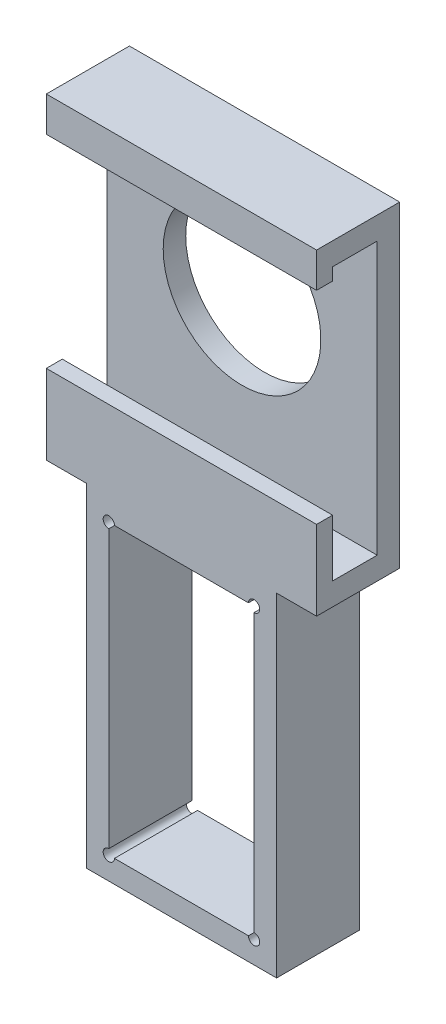
ISO-10303-21;
HEADER;
FILE_DESCRIPTION(('STEP AP214'),'2;1');
FILE_NAME('part.step','',(''),(''),'','','');
FILE_SCHEMA(('AUTOMOTIVE_DESIGN { 1 0 10303 214 1 1 1 1 }'));
ENDSEC;
DATA;
#1=APPLICATION_CONTEXT('core data for automotive mechanical design processes');
#2=APPLICATION_PROTOCOL_DEFINITION('international standard','automotive_design',2000,#1);
#3=PRODUCT_CONTEXT('',#1,'mechanical');
#4=PRODUCT('Part','Part','',(#3));
#5=PRODUCT_RELATED_PRODUCT_CATEGORY('part','',(#4));
#6=PRODUCT_DEFINITION_FORMATION('','',#4);
#7=PRODUCT_DEFINITION_CONTEXT('part definition',#1,'design');
#8=PRODUCT_DEFINITION('design','',#6,#7);
#9=PRODUCT_DEFINITION_SHAPE('','',#8);
#10=(LENGTH_UNIT() NAMED_UNIT(*) SI_UNIT(.MILLI.,.METRE.));
#11=(NAMED_UNIT(*) PLANE_ANGLE_UNIT() SI_UNIT($,.RADIAN.));
#12=(NAMED_UNIT(*) SI_UNIT($,.STERADIAN.) SOLID_ANGLE_UNIT());
#13=UNCERTAINTY_MEASURE_WITH_UNIT(LENGTH_MEASURE(1.E-05),#10,'distance_accuracy_value','');
#14=(GEOMETRIC_REPRESENTATION_CONTEXT(3) GLOBAL_UNCERTAINTY_ASSIGNED_CONTEXT((#13)) GLOBAL_UNIT_ASSIGNED_CONTEXT((#10,
#11,#12)) REPRESENTATION_CONTEXT('',''));
#15=CARTESIAN_POINT('',(0.,0.,0.));
#16=DIRECTION('',(0.,0.,1.));
#17=DIRECTION('',(1.,0.,0.));
#18=AXIS2_PLACEMENT_3D('',#15,#16,#17);
#19=CARTESIAN_POINT('',(-24.,-32.12,-2.));
#20=DIRECTION('',(0.,-1.,0.));
#21=DIRECTION('',(0.,0.,-1.));
#22=AXIS2_PLACEMENT_3D('',#19,#20,#21);
#23=PLANE('',#22);
#24=DIRECTION('',(1.,0.,0.));
#25=VECTOR('',#24,1.);
#26=CARTESIAN_POINT('',(-24.,-32.12,-2.));
#27=LINE('',#26,#25);
#28=CARTESIAN_POINT('',(-24.,-32.12,-2.));
#29=VERTEX_POINT('',#28);
#30=CARTESIAN_POINT('',(-16.9,-32.12,-2.));
#31=VERTEX_POINT('',#30);
#32=EDGE_CURVE('E365',#29,#31,#27,.T.);
#33=ORIENTED_EDGE('',*,*,#32,.T.);
#34=DIRECTION('',(0.,0.,1.));
#35=VECTOR('',#34,1.);
#36=CARTESIAN_POINT('',(-16.9,-32.12,-70.1694946438655));
#37=LINE('',#36,#35);
#38=CARTESIAN_POINT('',(-16.9,-32.12,12.76));
#39=VERTEX_POINT('',#38);
#40=EDGE_CURVE('E257',#31,#39,#37,.T.);
#41=ORIENTED_EDGE('',*,*,#40,.T.);
#42=DIRECTION('',(-1.,0.,0.));
#43=VECTOR('',#42,1.);
#44=CARTESIAN_POINT('',(24.,-32.12,12.76));
#45=LINE('',#44,#43);
#46=CARTESIAN_POINT('',(-24.,-32.12,12.76));
#47=VERTEX_POINT('',#46);
#48=EDGE_CURVE('E277',#39,#47,#45,.T.);
#49=ORIENTED_EDGE('',*,*,#48,.T.);
#50=DIRECTION('',(0.,0.,1.));
#51=VECTOR('',#50,1.);
#52=CARTESIAN_POINT('',(-24.,-32.12,-2.));
#53=LINE('',#52,#51);
#54=EDGE_CURVE('E368',#29,#47,#53,.T.);
#55=ORIENTED_EDGE('',*,*,#54,.F.);
#56=EDGE_LOOP('',(#33,#41,#49,#55));
#57=FACE_BOUND('',#56,.T.);
#58=ADVANCED_FACE('F39',(#57),#23,.T.);
#59=CARTESIAN_POINT('',(0.,0.,2.));
#60=DIRECTION('',(0.,0.,-1.));
#61=DIRECTION('',(-1.,0.,0.));
#62=AXIS2_PLACEMENT_3D('',#59,#60,#61);
#63=PLANE('',#62);
#64=CARTESIAN_POINT('',(0.,0.,2.));
#65=DIRECTION('',(0.,0.,-1.));
#66=DIRECTION('',(-1.,0.,0.));
#67=AXIS2_PLACEMENT_3D('',#64,#65,#66);
#68=CIRCLE('',#67,14.);
#69=CARTESIAN_POINT('',(-14.,0.,2.));
#70=VERTEX_POINT('',#69);
#71=EDGE_CURVE('E274',#70,#70,#68,.T.);
#72=ORIENTED_EDGE('',*,*,#71,.T.);
#73=EDGE_LOOP('',(#72));
#74=FACE_BOUND('',#73,.T.);
#75=DIRECTION('',(0.,1.,0.));
#76=VECTOR('',#75,1.);
#77=CARTESIAN_POINT('',(24.,-32.12,2.));
#78=LINE('',#77,#76);
#79=CARTESIAN_POINT('',(24.,-28.12,2.));
#80=VERTEX_POINT('',#79);
#81=CARTESIAN_POINT('',(24.,20.2,2.));
#82=VERTEX_POINT('',#81);
#83=EDGE_CURVE('E353',#80,#82,#78,.T.);
#84=ORIENTED_EDGE('',*,*,#83,.T.);
#85=DIRECTION('',(-1.,0.,0.));
#86=VECTOR('',#85,1.);
#87=CARTESIAN_POINT('',(24.,20.2,2.));
#88=LINE('',#87,#86);
#89=CARTESIAN_POINT('',(-24.,20.2,2.));
#90=VERTEX_POINT('',#89);
#91=EDGE_CURVE('E291',#82,#90,#88,.T.);
#92=ORIENTED_EDGE('',*,*,#91,.T.);
#93=DIRECTION('',(0.,1.,0.));
#94=VECTOR('',#93,1.);
#95=CARTESIAN_POINT('',(-24.,-32.12,2.));
#96=LINE('',#95,#94);
#97=CARTESIAN_POINT('',(-24.,-28.12,2.));
#98=VERTEX_POINT('',#97);
#99=EDGE_CURVE('E307',#98,#90,#96,.T.);
#100=ORIENTED_EDGE('',*,*,#99,.F.);
#101=DIRECTION('',(-1.,0.,0.));
#102=VECTOR('',#101,1.);
#103=CARTESIAN_POINT('',(24.,-28.12,2.));
#104=LINE('',#103,#102);
#105=EDGE_CURVE('E323',#80,#98,#104,.T.);
#106=ORIENTED_EDGE('',*,*,#105,.F.);
#107=EDGE_LOOP('',(#84,#92,#100,#106));
#108=FACE_BOUND('',#107,.T.);
#109=ADVANCED_FACE('F458',(#74,#108),#63,.F.);
#110=CARTESIAN_POINT('',(-24.,-32.12,-2.));
#111=DIRECTION('',(1.,0.,0.));
#112=DIRECTION('',(0.,0.,-1.));
#113=AXIS2_PLACEMENT_3D('',#110,#111,#112);
#114=PLANE('',#113);
#115=ORIENTED_EDGE('',*,*,#54,.T.);
#116=DIRECTION('',(0.,1.,0.));
#117=VECTOR('',#116,1.);
#118=CARTESIAN_POINT('',(-24.,-32.12,12.76));
#119=LINE('',#118,#117);
#120=CARTESIAN_POINT('',(-24.,-18.,12.76));
#121=VERTEX_POINT('',#120);
#122=EDGE_CURVE('E296',#47,#121,#119,.T.);
#123=ORIENTED_EDGE('',*,*,#122,.T.);
#124=DIRECTION('',(0.,0.,-1.));
#125=VECTOR('',#124,1.);
#126=CARTESIAN_POINT('',(-24.,-18.,12.76));
#127=LINE('',#126,#125);
#128=CARTESIAN_POINT('',(-24.,-18.,9.92));
#129=VERTEX_POINT('',#128);
#130=EDGE_CURVE('E336',#121,#129,#127,.T.);
#131=ORIENTED_EDGE('',*,*,#130,.T.);
#132=DIRECTION('',(0.,-1.,0.));
#133=VECTOR('',#132,1.);
#134=CARTESIAN_POINT('',(-24.,-18.,9.92));
#135=LINE('',#134,#133);
#136=CARTESIAN_POINT('',(-24.,-28.12,9.92));
#137=VERTEX_POINT('',#136);
#138=EDGE_CURVE('E332',#129,#137,#135,.T.);
#139=ORIENTED_EDGE('',*,*,#138,.T.);
#140=DIRECTION('',(0.,0.,-1.));
#141=VECTOR('',#140,1.);
#142=CARTESIAN_POINT('',(-24.,-28.12,9.92));
#143=LINE('',#142,#141);
#144=EDGE_CURVE('E329',#137,#98,#143,.T.);
#145=ORIENTED_EDGE('',*,*,#144,.T.);
#146=ORIENTED_EDGE('',*,*,#99,.T.);
#147=DIRECTION('',(0.,0.,1.));
#148=VECTOR('',#147,1.);
#149=CARTESIAN_POINT('',(-24.,20.2,9.92));
#150=LINE('',#149,#148);
#151=CARTESIAN_POINT('',(-24.,20.2,9.92));
#152=VERTEX_POINT('',#151);
#153=EDGE_CURVE('E292',#90,#152,#150,.T.);
#154=ORIENTED_EDGE('',*,*,#153,.T.);
#155=DIRECTION('',(0.,-1.,0.));
#156=VECTOR('',#155,1.);
#157=CARTESIAN_POINT('',(-24.,18.,9.92));
#158=LINE('',#157,#156);
#159=CARTESIAN_POINT('',(-24.,18.,9.92));
#160=VERTEX_POINT('',#159);
#161=EDGE_CURVE('E295',#152,#160,#158,.T.);
#162=ORIENTED_EDGE('',*,*,#161,.T.);
#163=DIRECTION('',(0.,0.,1.));
#164=VECTOR('',#163,1.);
#165=CARTESIAN_POINT('',(-24.,18.,12.76));
#166=LINE('',#165,#164);
#167=CARTESIAN_POINT('',(-24.,18.,12.76));
#168=VERTEX_POINT('',#167);
#169=EDGE_CURVE('E299',#160,#168,#166,.T.);
#170=ORIENTED_EDGE('',*,*,#169,.T.);
#171=DIRECTION('',(0.,1.,0.));
#172=VECTOR('',#171,1.);
#173=CARTESIAN_POINT('',(-24.,24.2,12.76));
#174=LINE('',#173,#172);
#175=CARTESIAN_POINT('',(-24.,24.2,12.76));
#176=VERTEX_POINT('',#175);
#177=EDGE_CURVE('E282',#168,#176,#174,.T.);
#178=ORIENTED_EDGE('',*,*,#177,.T.);
#179=DIRECTION('',(0.,0.,1.));
#180=VECTOR('',#179,1.);
#181=CARTESIAN_POINT('',(-24.,24.2,-2.));
#182=LINE('',#181,#180);
#183=CARTESIAN_POINT('',(-24.,24.2,-2.));
#184=VERTEX_POINT('',#183);
#185=EDGE_CURVE('E375',#184,#176,#182,.T.);
#186=ORIENTED_EDGE('',*,*,#185,.F.);
#187=DIRECTION('',(0.,1.,0.));
#188=VECTOR('',#187,1.);
#189=CARTESIAN_POINT('',(-24.,-32.12,-2.));
#190=LINE('',#189,#188);
#191=EDGE_CURVE('E356',#29,#184,#190,.T.);
#192=ORIENTED_EDGE('',*,*,#191,.F.);
#193=EDGE_LOOP('',(#115,#123,#131,#139,#145,#146,#154,#162,#170,#178,#186,#192));
#194=FACE_BOUND('',#193,.T.);
#195=ADVANCED_FACE('F41',(#194),#114,.F.);
#196=CARTESIAN_POINT('',(-24.,24.2,-2.));
#197=DIRECTION('',(0.,-1.,0.));
#198=DIRECTION('',(1.,0.,0.));
#199=AXIS2_PLACEMENT_3D('',#196,#197,#198);
#200=PLANE('',#199);
#201=ORIENTED_EDGE('',*,*,#185,.T.);
#202=DIRECTION('',(-1.,0.,0.));
#203=VECTOR('',#202,1.);
#204=CARTESIAN_POINT('',(24.,24.2,12.76));
#205=LINE('',#204,#203);
#206=CARTESIAN_POINT('',(24.,24.2,12.76));
#207=VERTEX_POINT('',#206);
#208=EDGE_CURVE('E304',#207,#176,#205,.T.);
#209=ORIENTED_EDGE('',*,*,#208,.F.);
#210=DIRECTION('',(0.,0.,1.));
#211=VECTOR('',#210,1.);
#212=CARTESIAN_POINT('',(24.,24.2,-2.));
#213=LINE('',#212,#211);
#214=CARTESIAN_POINT('',(24.,24.2,-2.));
#215=VERTEX_POINT('',#214);
#216=EDGE_CURVE('E373',#215,#207,#213,.T.);
#217=ORIENTED_EDGE('',*,*,#216,.F.);
#218=DIRECTION('',(1.,0.,0.));
#219=VECTOR('',#218,1.);
#220=CARTESIAN_POINT('',(-24.,24.2,-2.));
#221=LINE('',#220,#219);
#222=EDGE_CURVE('E359',#184,#215,#221,.T.);
#223=ORIENTED_EDGE('',*,*,#222,.F.);
#224=EDGE_LOOP('',(#201,#209,#217,#223));
#225=FACE_BOUND('',#224,.T.);
#226=ADVANCED_FACE('F441',(#225),#200,.F.);
#227=CARTESIAN_POINT('',(24.,-32.12,-2.));
#228=DIRECTION('',(1.,0.,0.));
#229=DIRECTION('',(0.,0.,-1.));
#230=AXIS2_PLACEMENT_3D('',#227,#228,#229);
#231=PLANE('',#230);
#232=ORIENTED_EDGE('',*,*,#216,.T.);
#233=DIRECTION('',(0.,1.,0.));
#234=VECTOR('',#233,1.);
#235=CARTESIAN_POINT('',(24.,24.2,12.76));
#236=LINE('',#235,#234);
#237=CARTESIAN_POINT('',(24.,18.,12.76));
#238=VERTEX_POINT('',#237);
#239=EDGE_CURVE('E288',#238,#207,#236,.T.);
#240=ORIENTED_EDGE('',*,*,#239,.F.);
#241=DIRECTION('',(0.,0.,1.));
#242=VECTOR('',#241,1.);
#243=CARTESIAN_POINT('',(24.,18.,12.76));
#244=LINE('',#243,#242);
#245=CARTESIAN_POINT('',(24.,18.,9.92));
#246=VERTEX_POINT('',#245);
#247=EDGE_CURVE('E285',#246,#238,#244,.T.);
#248=ORIENTED_EDGE('',*,*,#247,.F.);
#249=DIRECTION('',(0.,-1.,0.));
#250=VECTOR('',#249,1.);
#251=CARTESIAN_POINT('',(24.,18.,9.92));
#252=LINE('',#251,#250);
#253=CARTESIAN_POINT('',(24.,20.2,9.92));
#254=VERTEX_POINT('',#253);
#255=EDGE_CURVE('E281',#254,#246,#252,.T.);
#256=ORIENTED_EDGE('',*,*,#255,.F.);
#257=DIRECTION('',(0.,0.,1.));
#258=VECTOR('',#257,1.);
#259=CARTESIAN_POINT('',(24.,20.2,9.92));
#260=LINE('',#259,#258);
#261=EDGE_CURVE('E278',#82,#254,#260,.T.);
#262=ORIENTED_EDGE('',*,*,#261,.F.);
#263=ORIENTED_EDGE('',*,*,#83,.F.);
#264=DIRECTION('',(0.,0.,-1.));
#265=VECTOR('',#264,1.);
#266=CARTESIAN_POINT('',(24.,-28.12,9.92));
#267=LINE('',#266,#265);
#268=CARTESIAN_POINT('',(24.,-28.12,9.92));
#269=VERTEX_POINT('',#268);
#270=EDGE_CURVE('E318',#269,#80,#267,.T.);
#271=ORIENTED_EDGE('',*,*,#270,.F.);
#272=DIRECTION('',(0.,-1.,0.));
#273=VECTOR('',#272,1.);
#274=CARTESIAN_POINT('',(24.,-18.,9.92));
#275=LINE('',#274,#273);
#276=CARTESIAN_POINT('',(24.,-18.,9.92));
#277=VERTEX_POINT('',#276);
#278=EDGE_CURVE('E343',#277,#269,#275,.T.);
#279=ORIENTED_EDGE('',*,*,#278,.F.);
#280=DIRECTION('',(0.,0.,-1.));
#281=VECTOR('',#280,1.);
#282=CARTESIAN_POINT('',(24.,-18.,12.76));
#283=LINE('',#282,#281);
#284=CARTESIAN_POINT('',(24.,-18.,12.76));
#285=VERTEX_POINT('',#284);
#286=EDGE_CURVE('E346',#285,#277,#283,.T.);
#287=ORIENTED_EDGE('',*,*,#286,.F.);
#288=DIRECTION('',(0.,1.,0.));
#289=VECTOR('',#288,1.);
#290=CARTESIAN_POINT('',(24.,-32.12,12.76));
#291=LINE('',#290,#289);
#292=CARTESIAN_POINT('',(24.,-32.12,12.76));
#293=VERTEX_POINT('',#292);
#294=EDGE_CURVE('E333',#293,#285,#291,.T.);
#295=ORIENTED_EDGE('',*,*,#294,.F.);
#296=DIRECTION('',(0.,0.,1.));
#297=VECTOR('',#296,1.);
#298=CARTESIAN_POINT('',(24.,-32.12,-2.));
#299=LINE('',#298,#297);
#300=CARTESIAN_POINT('',(24.,-32.12,-2.));
#301=VERTEX_POINT('',#300);
#302=EDGE_CURVE('E371',#301,#293,#299,.T.);
#303=ORIENTED_EDGE('',*,*,#302,.F.);
#304=DIRECTION('',(0.,1.,0.));
#305=VECTOR('',#304,1.);
#306=CARTESIAN_POINT('',(24.,-32.12,-2.));
#307=LINE('',#306,#305);
#308=EDGE_CURVE('E361',#301,#215,#307,.T.);
#309=ORIENTED_EDGE('',*,*,#308,.T.);
#310=EDGE_LOOP('',(#232,#240,#248,#256,#262,#263,#271,#279,#287,#295,#303,#309));
#311=FACE_BOUND('',#310,.T.);
#312=ADVANCED_FACE('F436',(#311),#231,.T.);
#313=DIRECTION('',(0.,0.,1.));
#314=VECTOR('',#313,1.);
#315=CARTESIAN_POINT('',(16.9,-32.12,-70.1694946438655));
#316=LINE('',#315,#314);
#317=CARTESIAN_POINT('',(16.9,-32.12,-2.));
#318=VERTEX_POINT('',#317);
#319=CARTESIAN_POINT('',(16.9,-32.12,12.76));
#320=VERTEX_POINT('',#319);
#321=EDGE_CURVE('E238',#318,#320,#316,.T.);
#322=ORIENTED_EDGE('',*,*,#321,.F.);
#323=EDGE_CURVE('E364',#318,#301,#27,.T.);
#324=ORIENTED_EDGE('',*,*,#323,.T.);
#325=ORIENTED_EDGE('',*,*,#302,.T.);
#326=EDGE_CURVE('E326',#293,#320,#45,.T.);
#327=ORIENTED_EDGE('',*,*,#326,.T.);
#328=EDGE_LOOP('',(#322,#324,#325,#327));
#329=FACE_BOUND('',#328,.T.);
#330=ADVANCED_FACE('F431',(#329),#23,.T.);
#331=CARTESIAN_POINT('',(0.,0.,-2.));
#332=DIRECTION('',(0.,0.,-1.));
#333=DIRECTION('',(-1.,0.,0.));
#334=AXIS2_PLACEMENT_3D('',#331,#332,#333);
#335=PLANE('',#334);
#336=CARTESIAN_POINT('',(-12.9,-87.32,-2.));
#337=DIRECTION('',(0.,0.,1.));
#338=DIRECTION('',(1.,0.,0.));
#339=AXIS2_PLACEMENT_3D('',#336,#337,#338);
#340=CIRCLE('',#339,1.);
#341=CARTESIAN_POINT('',(-12.9,-86.32,-2.));
#342=VERTEX_POINT('',#341);
#343=CARTESIAN_POINT('',(-11.9,-87.32,-2.));
#344=VERTEX_POINT('',#343);
#345=EDGE_CURVE('E391',#342,#344,#340,.T.);
#346=ORIENTED_EDGE('',*,*,#345,.T.);
#347=DIRECTION('',(1.,0.,0.));
#348=VECTOR('',#347,1.);
#349=CARTESIAN_POINT('',(-12.9,-87.32,-2.));
#350=LINE('',#349,#348);
#351=CARTESIAN_POINT('',(11.9,-87.32,-2.));
#352=VERTEX_POINT('',#351);
#353=EDGE_CURVE('E242',#344,#352,#350,.T.);
#354=ORIENTED_EDGE('',*,*,#353,.T.);
#355=CARTESIAN_POINT('',(12.9,-87.32,-2.));
#356=DIRECTION('',(0.,0.,1.));
#357=DIRECTION('',(1.,0.,0.));
#358=AXIS2_PLACEMENT_3D('',#355,#356,#357);
#359=CIRCLE('',#358,1.);
#360=CARTESIAN_POINT('',(12.9,-86.32,-2.));
#361=VERTEX_POINT('',#360);
#362=EDGE_CURVE('E744',#352,#361,#359,.T.);
#363=ORIENTED_EDGE('',*,*,#362,.T.);
#364=DIRECTION('',(0.,1.,0.));
#365=VECTOR('',#364,1.);
#366=CARTESIAN_POINT('',(12.9,-36.12,-2.));
#367=LINE('',#366,#365);
#368=CARTESIAN_POINT('',(12.9,-37.12,-2.));
#369=VERTEX_POINT('',#368);
#370=EDGE_CURVE('E246',#361,#369,#367,.T.);
#371=ORIENTED_EDGE('',*,*,#370,.T.);
#372=CARTESIAN_POINT('',(12.9,-36.12,-2.));
#373=DIRECTION('',(0.,0.,1.));
#374=DIRECTION('',(1.,0.,0.));
#375=AXIS2_PLACEMENT_3D('',#372,#373,#374);
#376=CIRCLE('',#375,1.);
#377=CARTESIAN_POINT('',(11.9,-36.12,-2.));
#378=VERTEX_POINT('',#377);
#379=EDGE_CURVE('E749',#369,#378,#376,.T.);
#380=ORIENTED_EDGE('',*,*,#379,.T.);
#381=DIRECTION('',(-1.,0.,0.));
#382=VECTOR('',#381,1.);
#383=CARTESIAN_POINT('',(-12.9,-36.12,-2.));
#384=LINE('',#383,#382);
#385=CARTESIAN_POINT('',(-11.9,-36.12,-2.));
#386=VERTEX_POINT('',#385);
#387=EDGE_CURVE('E243',#378,#386,#384,.T.);
#388=ORIENTED_EDGE('',*,*,#387,.T.);
#389=CARTESIAN_POINT('',(-12.9,-36.12,-2.));
#390=DIRECTION('',(0.,0.,1.));
#391=DIRECTION('',(1.,0.,0.));
#392=AXIS2_PLACEMENT_3D('',#389,#390,#391);
#393=CIRCLE('',#392,1.);
#394=CARTESIAN_POINT('',(-12.9,-37.12,-2.));
#395=VERTEX_POINT('',#394);
#396=EDGE_CURVE('E204',#386,#395,#393,.T.);
#397=ORIENTED_EDGE('',*,*,#396,.T.);
#398=DIRECTION('',(0.,-1.,0.));
#399=VECTOR('',#398,1.);
#400=CARTESIAN_POINT('',(-12.9,-36.12,-2.));
#401=LINE('',#400,#399);
#402=EDGE_CURVE('E239',#395,#342,#401,.T.);
#403=ORIENTED_EDGE('',*,*,#402,.T.);
#404=EDGE_LOOP('',(#346,#354,#363,#371,#380,#388,#397,#403));
#405=FACE_BOUND('',#404,.T.);
#406=CARTESIAN_POINT('',(0.,0.,-2.));
#407=DIRECTION('',(0.,0.,-1.));
#408=DIRECTION('',(-1.,0.,0.));
#409=AXIS2_PLACEMENT_3D('',#406,#407,#408);
#410=CIRCLE('',#409,14.);
#411=CARTESIAN_POINT('',(-14.,0.,-2.));
#412=VERTEX_POINT('',#411);
#413=EDGE_CURVE('E271',#412,#412,#410,.T.);
#414=ORIENTED_EDGE('',*,*,#413,.F.);
#415=EDGE_LOOP('',(#414));
#416=FACE_BOUND('',#415,.T.);
#417=ORIENTED_EDGE('',*,*,#191,.T.);
#418=ORIENTED_EDGE('',*,*,#222,.T.);
#419=ORIENTED_EDGE('',*,*,#308,.F.);
#420=ORIENTED_EDGE('',*,*,#323,.F.);
#421=DIRECTION('',(0.,1.,0.));
#422=VECTOR('',#421,1.);
#423=CARTESIAN_POINT('',(16.9,-32.12,-2.));
#424=LINE('',#423,#422);
#425=CARTESIAN_POINT('',(16.9,-91.32,-2.));
#426=VERTEX_POINT('',#425);
#427=EDGE_CURVE('E255',#426,#318,#424,.T.);
#428=ORIENTED_EDGE('',*,*,#427,.F.);
#429=DIRECTION('',(1.,0.,0.));
#430=VECTOR('',#429,1.);
#431=CARTESIAN_POINT('',(-16.9,-91.32,-2.));
#432=LINE('',#431,#430);
#433=CARTESIAN_POINT('',(-16.9,-91.32,-2.));
#434=VERTEX_POINT('',#433);
#435=EDGE_CURVE('E235',#434,#426,#432,.T.);
#436=ORIENTED_EDGE('',*,*,#435,.F.);
#437=DIRECTION('',(0.,-1.,0.));
#438=VECTOR('',#437,1.);
#439=CARTESIAN_POINT('',(-16.9,-32.12,-2.));
#440=LINE('',#439,#438);
#441=EDGE_CURVE('E250',#31,#434,#440,.T.);
#442=ORIENTED_EDGE('',*,*,#441,.F.);
#443=ORIENTED_EDGE('',*,*,#32,.F.);
#444=EDGE_LOOP('',(#417,#418,#419,#420,#428,#436,#442,#443));
#445=FACE_BOUND('',#444,.T.);
#446=ADVANCED_FACE('F389',(#405,#416,#445),#335,.T.);
#447=CARTESIAN_POINT('',(24.,-32.12,12.76));
#448=DIRECTION('',(0.,0.,1.));
#449=DIRECTION('',(1.,0.,0.));
#450=AXIS2_PLACEMENT_3D('',#447,#448,#449);
#451=PLANE('',#450);
#452=CARTESIAN_POINT('',(-12.9,-87.32,12.76));
#453=DIRECTION('',(0.,0.,1.));
#454=DIRECTION('',(1.,0.,0.));
#455=AXIS2_PLACEMENT_3D('',#452,#453,#454);
#456=CIRCLE('',#455,1.);
#457=CARTESIAN_POINT('',(-12.9,-86.32,12.76));
#458=VERTEX_POINT('',#457);
#459=CARTESIAN_POINT('',(-11.9,-87.32,12.76));
#460=VERTEX_POINT('',#459);
#461=EDGE_CURVE('E743',#458,#460,#456,.T.);
#462=ORIENTED_EDGE('',*,*,#461,.F.);
#463=DIRECTION('',(0.,-1.,0.));
#464=VECTOR('',#463,1.);
#465=CARTESIAN_POINT('',(-12.9,-36.12,12.76));
#466=LINE('',#465,#464);
#467=CARTESIAN_POINT('',(-12.9,-37.12,12.76));
#468=VERTEX_POINT('',#467);
#469=EDGE_CURVE('E219',#468,#458,#466,.T.);
#470=ORIENTED_EDGE('',*,*,#469,.F.);
#471=CARTESIAN_POINT('',(-12.9,-36.12,12.76));
#472=DIRECTION('',(0.,0.,1.));
#473=DIRECTION('',(1.,0.,0.));
#474=AXIS2_PLACEMENT_3D('',#471,#472,#473);
#475=CIRCLE('',#474,1.);
#476=CARTESIAN_POINT('',(-11.9,-36.12,12.76));
#477=VERTEX_POINT('',#476);
#478=EDGE_CURVE('E201',#477,#468,#475,.T.);
#479=ORIENTED_EDGE('',*,*,#478,.F.);
#480=DIRECTION('',(-1.,0.,0.));
#481=VECTOR('',#480,1.);
#482=CARTESIAN_POINT('',(-12.9,-36.12,12.76));
#483=LINE('',#482,#481);
#484=CARTESIAN_POINT('',(11.9,-36.12,12.76));
#485=VERTEX_POINT('',#484);
#486=EDGE_CURVE('E217',#485,#477,#483,.T.);
#487=ORIENTED_EDGE('',*,*,#486,.F.);
#488=CARTESIAN_POINT('',(12.9,-36.12,12.76));
#489=DIRECTION('',(0.,0.,1.));
#490=DIRECTION('',(1.,0.,0.));
#491=AXIS2_PLACEMENT_3D('',#488,#489,#490);
#492=CIRCLE('',#491,1.);
#493=CARTESIAN_POINT('',(12.9,-37.12,12.76));
#494=VERTEX_POINT('',#493);
#495=EDGE_CURVE('E61',#494,#485,#492,.T.);
#496=ORIENTED_EDGE('',*,*,#495,.F.);
#497=DIRECTION('',(0.,1.,0.));
#498=VECTOR('',#497,1.);
#499=CARTESIAN_POINT('',(12.9,-36.12,12.76));
#500=LINE('',#499,#498);
#501=CARTESIAN_POINT('',(12.9,-86.32,12.76));
#502=VERTEX_POINT('',#501);
#503=EDGE_CURVE('E222',#502,#494,#500,.T.);
#504=ORIENTED_EDGE('',*,*,#503,.F.);
#505=CARTESIAN_POINT('',(12.9,-87.32,12.76));
#506=DIRECTION('',(0.,0.,1.));
#507=DIRECTION('',(1.,0.,0.));
#508=AXIS2_PLACEMENT_3D('',#505,#506,#507);
#509=CIRCLE('',#508,1.);
#510=CARTESIAN_POINT('',(11.9,-87.32,12.76));
#511=VERTEX_POINT('',#510);
#512=EDGE_CURVE('E54',#511,#502,#509,.T.);
#513=ORIENTED_EDGE('',*,*,#512,.F.);
#514=DIRECTION('',(1.,0.,0.));
#515=VECTOR('',#514,1.);
#516=CARTESIAN_POINT('',(-12.9,-87.32,12.76));
#517=LINE('',#516,#515);
#518=EDGE_CURVE('E225',#460,#511,#517,.T.);
#519=ORIENTED_EDGE('',*,*,#518,.F.);
#520=EDGE_LOOP('',(#462,#470,#479,#487,#496,#504,#513,#519));
#521=FACE_BOUND('',#520,.T.);
#522=ORIENTED_EDGE('',*,*,#122,.F.);
#523=ORIENTED_EDGE('',*,*,#48,.F.);
#524=DIRECTION('',(0.,-1.,0.));
#525=VECTOR('',#524,1.);
#526=CARTESIAN_POINT('',(-16.9,-32.12,12.76));
#527=LINE('',#526,#525);
#528=CARTESIAN_POINT('',(-16.9,-91.32,12.76));
#529=VERTEX_POINT('',#528);
#530=EDGE_CURVE('E230',#39,#529,#527,.T.);
#531=ORIENTED_EDGE('',*,*,#530,.T.);
#532=DIRECTION('',(1.,0.,0.));
#533=VECTOR('',#532,1.);
#534=CARTESIAN_POINT('',(-16.9,-91.32,12.76));
#535=LINE('',#534,#533);
#536=CARTESIAN_POINT('',(16.9,-91.32,12.76));
#537=VERTEX_POINT('',#536);
#538=EDGE_CURVE('E406',#529,#537,#535,.T.);
#539=ORIENTED_EDGE('',*,*,#538,.T.);
#540=DIRECTION('',(0.,1.,0.));
#541=VECTOR('',#540,1.);
#542=CARTESIAN_POINT('',(16.9,-32.12,12.76));
#543=LINE('',#542,#541);
#544=EDGE_CURVE('E245',#537,#320,#543,.T.);
#545=ORIENTED_EDGE('',*,*,#544,.T.);
#546=ORIENTED_EDGE('',*,*,#326,.F.);
#547=ORIENTED_EDGE('',*,*,#294,.T.);
#548=DIRECTION('',(-1.,0.,0.));
#549=VECTOR('',#548,1.);
#550=CARTESIAN_POINT('',(24.,-18.,12.76));
#551=LINE('',#550,#549);
#552=EDGE_CURVE('E316',#285,#121,#551,.T.);
#553=ORIENTED_EDGE('',*,*,#552,.T.);
#554=EDGE_LOOP('',(#522,#523,#531,#539,#545,#546,#547,#553));
#555=FACE_BOUND('',#554,.T.);
#556=ADVANCED_FACE('F215',(#521,#555),#451,.T.);
#557=CARTESIAN_POINT('',(24.,-28.12,9.92));
#558=DIRECTION('',(0.,1.,0.));
#559=DIRECTION('',(0.,0.,1.));
#560=AXIS2_PLACEMENT_3D('',#557,#558,#559);
#561=PLANE('',#560);
#562=CARTESIAN_POINT('',(0.,-28.12,5.37999999999999));
#563=DIRECTION('',(0.,1.,0.));
#564=DIRECTION('',(0.,0.,1.));
#565=AXIS2_PLACEMENT_3D('',#562,#563,#564);
#566=CIRCLE('',#565,2.24789999999999);
#567=CARTESIAN_POINT('',(0.,-28.12,7.62789999999999));
#568=VERTEX_POINT('',#567);
#569=EDGE_CURVE('E270',#568,#568,#566,.T.);
#570=ORIENTED_EDGE('',*,*,#569,.F.);
#571=EDGE_LOOP('',(#570));
#572=FACE_BOUND('',#571,.T.);
#573=ORIENTED_EDGE('',*,*,#144,.F.);
#574=DIRECTION('',(-1.,0.,0.));
#575=VECTOR('',#574,1.);
#576=CARTESIAN_POINT('',(24.,-28.12,9.92));
#577=LINE('',#576,#575);
#578=EDGE_CURVE('E321',#269,#137,#577,.T.);
#579=ORIENTED_EDGE('',*,*,#578,.F.);
#580=ORIENTED_EDGE('',*,*,#270,.T.);
#581=ORIENTED_EDGE('',*,*,#105,.T.);
#582=EDGE_LOOP('',(#573,#579,#580,#581));
#583=FACE_BOUND('',#582,.T.);
#584=ADVANCED_FACE('F463',(#572,#583),#561,.T.);
#585=CARTESIAN_POINT('',(24.,-18.,9.92));
#586=DIRECTION('',(0.,0.,-1.));
#587=DIRECTION('',(0.,1.,0.));
#588=AXIS2_PLACEMENT_3D('',#585,#586,#587);
#589=PLANE('',#588);
#590=ORIENTED_EDGE('',*,*,#138,.F.);
#591=DIRECTION('',(-1.,0.,0.));
#592=VECTOR('',#591,1.);
#593=CARTESIAN_POINT('',(24.,-18.,9.92));
#594=LINE('',#593,#592);
#595=EDGE_CURVE('E319',#277,#129,#594,.T.);
#596=ORIENTED_EDGE('',*,*,#595,.F.);
#597=ORIENTED_EDGE('',*,*,#278,.T.);
#598=ORIENTED_EDGE('',*,*,#578,.T.);
#599=EDGE_LOOP('',(#590,#596,#597,#598));
#600=FACE_BOUND('',#599,.T.);
#601=ADVANCED_FACE('F467',(#600),#589,.T.);
#602=CARTESIAN_POINT('',(24.,-18.,12.76));
#603=DIRECTION('',(0.,1.,0.));
#604=DIRECTION('',(0.,0.,1.));
#605=AXIS2_PLACEMENT_3D('',#602,#603,#604);
#606=PLANE('',#605);
#607=ORIENTED_EDGE('',*,*,#130,.F.);
#608=ORIENTED_EDGE('',*,*,#552,.F.);
#609=ORIENTED_EDGE('',*,*,#286,.T.);
#610=ORIENTED_EDGE('',*,*,#595,.T.);
#611=EDGE_LOOP('',(#607,#608,#609,#610));
#612=FACE_BOUND('',#611,.T.);
#613=ADVANCED_FACE('F470',(#612),#606,.T.);
#614=CARTESIAN_POINT('',(24.,24.2,12.76));
#615=DIRECTION('',(0.,0.,1.));
#616=DIRECTION('',(0.,-1.,0.));
#617=AXIS2_PLACEMENT_3D('',#614,#615,#616);
#618=PLANE('',#617);
#619=ORIENTED_EDGE('',*,*,#177,.F.);
#620=DIRECTION('',(-1.,0.,0.));
#621=VECTOR('',#620,1.);
#622=CARTESIAN_POINT('',(24.,18.,12.76));
#623=LINE('',#622,#621);
#624=EDGE_CURVE('E308',#238,#168,#623,.T.);
#625=ORIENTED_EDGE('',*,*,#624,.F.);
#626=ORIENTED_EDGE('',*,*,#239,.T.);
#627=ORIENTED_EDGE('',*,*,#208,.T.);
#628=EDGE_LOOP('',(#619,#625,#626,#627));
#629=FACE_BOUND('',#628,.T.);
#630=ADVANCED_FACE('F471',(#629),#618,.T.);
#631=CARTESIAN_POINT('',(24.,18.,12.76));
#632=DIRECTION('',(0.,-1.,0.));
#633=DIRECTION('',(0.,0.,-1.));
#634=AXIS2_PLACEMENT_3D('',#631,#632,#633);
#635=PLANE('',#634);
#636=ORIENTED_EDGE('',*,*,#169,.F.);
#637=DIRECTION('',(-1.,0.,0.));
#638=VECTOR('',#637,1.);
#639=CARTESIAN_POINT('',(24.,18.,9.92));
#640=LINE('',#639,#638);
#641=EDGE_CURVE('E310',#246,#160,#640,.T.);
#642=ORIENTED_EDGE('',*,*,#641,.F.);
#643=ORIENTED_EDGE('',*,*,#247,.T.);
#644=ORIENTED_EDGE('',*,*,#624,.T.);
#645=EDGE_LOOP('',(#636,#642,#643,#644));
#646=FACE_BOUND('',#645,.T.);
#647=ADVANCED_FACE('F448',(#646),#635,.T.);
#648=CARTESIAN_POINT('',(24.,18.,9.92));
#649=DIRECTION('',(0.,0.,-1.));
#650=DIRECTION('',(-1.,0.,0.));
#651=AXIS2_PLACEMENT_3D('',#648,#649,#650);
#652=PLANE('',#651);
#653=ORIENTED_EDGE('',*,*,#161,.F.);
#654=DIRECTION('',(-1.,0.,0.));
#655=VECTOR('',#654,1.);
#656=CARTESIAN_POINT('',(24.,20.2,9.92));
#657=LINE('',#656,#655);
#658=EDGE_CURVE('E312',#254,#152,#657,.T.);
#659=ORIENTED_EDGE('',*,*,#658,.F.);
#660=ORIENTED_EDGE('',*,*,#255,.T.);
#661=ORIENTED_EDGE('',*,*,#641,.T.);
#662=EDGE_LOOP('',(#653,#659,#660,#661));
#663=FACE_BOUND('',#662,.T.);
#664=ADVANCED_FACE('F452',(#663),#652,.T.);
#665=CARTESIAN_POINT('',(24.,20.2,9.92));
#666=DIRECTION('',(0.,-1.,0.));
#667=DIRECTION('',(0.,0.,-1.));
#668=AXIS2_PLACEMENT_3D('',#665,#666,#667);
#669=PLANE('',#668);
#670=ORIENTED_EDGE('',*,*,#153,.F.);
#671=ORIENTED_EDGE('',*,*,#91,.F.);
#672=ORIENTED_EDGE('',*,*,#261,.T.);
#673=ORIENTED_EDGE('',*,*,#658,.T.);
#674=EDGE_LOOP('',(#670,#671,#672,#673));
#675=FACE_BOUND('',#674,.T.);
#676=ADVANCED_FACE('F456',(#675),#669,.T.);
#677=CARTESIAN_POINT('',(0.,0.,12.76));
#678=DIRECTION('',(0.,0.,-1.));
#679=DIRECTION('',(-1.,0.,0.));
#680=AXIS2_PLACEMENT_3D('',#677,#678,#679);
#681=CYLINDRICAL_SURFACE('',#680,14.);
#682=ORIENTED_EDGE('',*,*,#413,.T.);
#683=EDGE_LOOP('',(#682));
#684=FACE_BOUND('',#683,.T.);
#685=ORIENTED_EDGE('',*,*,#71,.F.);
#686=EDGE_LOOP('',(#685));
#687=FACE_BOUND('',#686,.T.);
#688=ADVANCED_FACE('F596',(#684,#687),#681,.F.);
#689=CARTESIAN_POINT('',(0.,-32.12,5.37999999999999));
#690=DIRECTION('',(0.,-1.,0.));
#691=DIRECTION('',(0.,0.,-1.));
#692=AXIS2_PLACEMENT_3D('',#689,#690,#691);
#693=CYLINDRICAL_SURFACE('',#692,2.24789999999999);
#694=ORIENTED_EDGE('',*,*,#569,.T.);
#695=EDGE_LOOP('',(#694));
#696=FACE_BOUND('',#695,.T.);
#697=CARTESIAN_POINT('',(0.,-30.4682323760275,5.37999999999999));
#698=DIRECTION('',(0.,-1.,0.));
#699=DIRECTION('',(0.,0.,-1.));
#700=AXIS2_PLACEMENT_3D('',#697,#698,#699);
#701=CIRCLE('',#700,2.24789999999999);
#702=CARTESIAN_POINT('',(0.,-30.4682323760275,3.1321));
#703=VERTEX_POINT('',#702);
#704=EDGE_CURVE('E267',#703,#703,#701,.T.);
#705=ORIENTED_EDGE('',*,*,#704,.T.);
#706=EDGE_LOOP('',(#705));
#707=FACE_BOUND('',#706,.T.);
#708=ADVANCED_FACE('F604',(#696,#707),#693,.F.);
#709=CARTESIAN_POINT('',(0.,-32.12,5.37999999999999));
#710=DIRECTION('',(0.,-1.,0.));
#711=DIRECTION('',(0.,0.,-1.));
#712=AXIS2_PLACEMENT_3D('',#709,#710,#711);
#713=CONICAL_SURFACE('',#712,4.2164,0.872664625997164);
#714=ORIENTED_EDGE('',*,*,#704,.F.);
#715=EDGE_LOOP('',(#714));
#716=FACE_BOUND('',#715,.T.);
#717=CARTESIAN_POINT('',(0.,-32.12,5.37999999999999));
#718=DIRECTION('',(0.,-1.,0.));
#719=DIRECTION('',(0.,0.,-1.));
#720=AXIS2_PLACEMENT_3D('',#717,#718,#719);
#721=CIRCLE('',#720,4.2164);
#722=CARTESIAN_POINT('',(0.,-32.12,1.16359999999999));
#723=VERTEX_POINT('',#722);
#724=EDGE_CURVE('E249',#723,#723,#721,.T.);
#725=ORIENTED_EDGE('',*,*,#724,.T.);
#726=EDGE_LOOP('',(#725));
#727=FACE_BOUND('',#726,.T.);
#728=ADVANCED_FACE('F612',(#716,#727),#713,.F.);
#729=CARTESIAN_POINT('',(-12.9,-87.32,-70.1694946438655));
#730=DIRECTION('',(0.,-1.,0.));
#731=DIRECTION('',(0.,0.,-1.));
#732=AXIS2_PLACEMENT_3D('',#729,#730,#731);
#733=PLANE('',#732);
#734=ORIENTED_EDGE('',*,*,#353,.F.);
#735=DIRECTION('',(0.,0.,1.));
#736=VECTOR('',#735,1.);
#737=CARTESIAN_POINT('',(-11.9,-87.32,-2.));
#738=LINE('',#737,#736);
#739=EDGE_CURVE('E209',#344,#460,#738,.T.);
#740=ORIENTED_EDGE('',*,*,#739,.T.);
#741=ORIENTED_EDGE('',*,*,#518,.T.);
#742=DIRECTION('',(0.,0.,1.));
#743=VECTOR('',#742,1.);
#744=CARTESIAN_POINT('',(11.9,-87.32,-2.));
#745=LINE('',#744,#743);
#746=EDGE_CURVE('E254',#511,#352,#745,.F.);
#747=ORIENTED_EDGE('',*,*,#746,.T.);
#748=EDGE_LOOP('',(#734,#740,#741,#747));
#749=FACE_BOUND('',#748,.T.);
#750=ADVANCED_FACE('F621',(#749),#733,.F.);
#751=CARTESIAN_POINT('',(12.9,-36.12,-70.1694946438655));
#752=DIRECTION('',(1.,0.,0.));
#753=DIRECTION('',(0.,1.,0.));
#754=AXIS2_PLACEMENT_3D('',#751,#752,#753);
#755=PLANE('',#754);
#756=ORIENTED_EDGE('',*,*,#370,.F.);
#757=DIRECTION('',(0.,0.,1.));
#758=VECTOR('',#757,1.);
#759=CARTESIAN_POINT('',(12.9,-86.32,-2.));
#760=LINE('',#759,#758);
#761=EDGE_CURVE('E11',#361,#502,#760,.T.);
#762=ORIENTED_EDGE('',*,*,#761,.T.);
#763=ORIENTED_EDGE('',*,*,#503,.T.);
#764=DIRECTION('',(0.,0.,1.));
#765=VECTOR('',#764,1.);
#766=CARTESIAN_POINT('',(12.9,-37.12,-2.));
#767=LINE('',#766,#765);
#768=EDGE_CURVE('E400',#494,#369,#767,.F.);
#769=ORIENTED_EDGE('',*,*,#768,.T.);
#770=EDGE_LOOP('',(#756,#762,#763,#769));
#771=FACE_BOUND('',#770,.T.);
#772=ADVANCED_FACE('F648',(#771),#755,.F.);
#773=CARTESIAN_POINT('',(-12.9,-36.12,-70.1694946438655));
#774=DIRECTION('',(0.,1.,0.));
#775=DIRECTION('',(0.,0.,1.));
#776=AXIS2_PLACEMENT_3D('',#773,#774,#775);
#777=PLANE('',#776);
#778=ORIENTED_EDGE('',*,*,#387,.F.);
#779=DIRECTION('',(0.,0.,1.));
#780=VECTOR('',#779,1.);
#781=CARTESIAN_POINT('',(11.9,-36.12,-2.));
#782=LINE('',#781,#780);
#783=EDGE_CURVE('E47',#378,#485,#782,.T.);
#784=ORIENTED_EDGE('',*,*,#783,.T.);
#785=ORIENTED_EDGE('',*,*,#486,.T.);
#786=DIRECTION('',(0.,0.,1.));
#787=VECTOR('',#786,1.);
#788=CARTESIAN_POINT('',(-11.9,-36.12,-2.));
#789=LINE('',#788,#787);
#790=EDGE_CURVE('E198',#477,#386,#789,.F.);
#791=ORIENTED_EDGE('',*,*,#790,.T.);
#792=EDGE_LOOP('',(#778,#784,#785,#791));
#793=FACE_BOUND('',#792,.T.);
#794=ADVANCED_FACE('F221',(#793),#777,.F.);
#795=CARTESIAN_POINT('',(-12.9,-36.12,-70.1694946438655));
#796=DIRECTION('',(-1.,0.,0.));
#797=DIRECTION('',(0.,-1.,0.));
#798=AXIS2_PLACEMENT_3D('',#795,#796,#797);
#799=PLANE('',#798);
#800=ORIENTED_EDGE('',*,*,#469,.T.);
#801=DIRECTION('',(0.,0.,1.));
#802=VECTOR('',#801,1.);
#803=CARTESIAN_POINT('',(-12.9,-86.32,-2.));
#804=LINE('',#803,#802);
#805=EDGE_CURVE('E381',#458,#342,#804,.F.);
#806=ORIENTED_EDGE('',*,*,#805,.T.);
#807=ORIENTED_EDGE('',*,*,#402,.F.);
#808=DIRECTION('',(0.,0.,1.));
#809=VECTOR('',#808,1.);
#810=CARTESIAN_POINT('',(-12.9,-37.12,-2.));
#811=LINE('',#810,#809);
#812=EDGE_CURVE('E377',#395,#468,#811,.T.);
#813=ORIENTED_EDGE('',*,*,#812,.T.);
#814=EDGE_LOOP('',(#800,#806,#807,#813));
#815=FACE_BOUND('',#814,.T.);
#816=ADVANCED_FACE('F385',(#815),#799,.F.);
#817=CARTESIAN_POINT('',(-16.9,-91.32,-70.1694946438655));
#818=DIRECTION('',(0.,-1.,0.));
#819=DIRECTION('',(0.,0.,-1.));
#820=AXIS2_PLACEMENT_3D('',#817,#818,#819);
#821=PLANE('',#820);
#822=DIRECTION('',(0.,0.,1.));
#823=VECTOR('',#822,1.);
#824=CARTESIAN_POINT('',(-16.9,-91.32,-70.1694946438655));
#825=LINE('',#824,#823);
#826=EDGE_CURVE('E253',#434,#529,#825,.T.);
#827=ORIENTED_EDGE('',*,*,#826,.F.);
#828=ORIENTED_EDGE('',*,*,#435,.T.);
#829=DIRECTION('',(0.,0.,1.));
#830=VECTOR('',#829,1.);
#831=CARTESIAN_POINT('',(16.9,-91.32,-70.1694946438655));
#832=LINE('',#831,#830);
#833=EDGE_CURVE('E227',#426,#537,#832,.T.);
#834=ORIENTED_EDGE('',*,*,#833,.T.);
#835=ORIENTED_EDGE('',*,*,#538,.F.);
#836=EDGE_LOOP('',(#827,#828,#834,#835));
#837=FACE_BOUND('',#836,.T.);
#838=ADVANCED_FACE('F422',(#837),#821,.T.);
#839=CARTESIAN_POINT('',(16.9,-32.12,-70.1694946438655));
#840=DIRECTION('',(1.,0.,0.));
#841=DIRECTION('',(0.,1.,0.));
#842=AXIS2_PLACEMENT_3D('',#839,#840,#841);
#843=PLANE('',#842);
#844=ORIENTED_EDGE('',*,*,#833,.F.);
#845=ORIENTED_EDGE('',*,*,#427,.T.);
#846=ORIENTED_EDGE('',*,*,#321,.T.);
#847=ORIENTED_EDGE('',*,*,#544,.F.);
#848=EDGE_LOOP('',(#844,#845,#846,#847));
#849=FACE_BOUND('',#848,.T.);
#850=ADVANCED_FACE('F426',(#849),#843,.T.);
#851=CARTESIAN_POINT('',(-16.9,-32.12,-70.1694946438655));
#852=DIRECTION('',(-1.,0.,0.));
#853=DIRECTION('',(0.,-1.,0.));
#854=AXIS2_PLACEMENT_3D('',#851,#852,#853);
#855=PLANE('',#854);
#856=ORIENTED_EDGE('',*,*,#40,.F.);
#857=ORIENTED_EDGE('',*,*,#441,.T.);
#858=ORIENTED_EDGE('',*,*,#826,.T.);
#859=ORIENTED_EDGE('',*,*,#530,.F.);
#860=EDGE_LOOP('',(#856,#857,#858,#859));
#861=FACE_BOUND('',#860,.T.);
#862=ADVANCED_FACE('F414',(#861),#855,.T.);
#863=CARTESIAN_POINT('',(-16.9,-32.12,-70.1694946438655));
#864=DIRECTION('',(0.,1.,0.));
#865=DIRECTION('',(0.,0.,1.));
#866=AXIS2_PLACEMENT_3D('',#863,#864,#865);
#867=PLANE('',#866);
#868=ORIENTED_EDGE('',*,*,#724,.F.);
#869=EDGE_LOOP('',(#868));
#870=FACE_BOUND('',#869,.T.);
#871=ADVANCED_FACE('F640',(#870),#867,.T.);
#872=CARTESIAN_POINT('',(-12.9,-36.12,-2.));
#873=DIRECTION('',(0.,0.,1.));
#874=DIRECTION('',(1.,0.,0.));
#875=AXIS2_PLACEMENT_3D('',#872,#873,#874);
#876=CYLINDRICAL_SURFACE('',#875,1.);
#877=ORIENTED_EDGE('',*,*,#478,.T.);
#878=ORIENTED_EDGE('',*,*,#812,.F.);
#879=ORIENTED_EDGE('',*,*,#396,.F.);
#880=ORIENTED_EDGE('',*,*,#790,.F.);
#881=EDGE_LOOP('',(#877,#878,#879,#880));
#882=FACE_BOUND('',#881,.T.);
#883=ADVANCED_FACE('F200',(#882),#876,.F.);
#884=CARTESIAN_POINT('',(-12.9,-87.32,-2.));
#885=DIRECTION('',(0.,0.,1.));
#886=DIRECTION('',(1.,0.,0.));
#887=AXIS2_PLACEMENT_3D('',#884,#885,#886);
#888=CYLINDRICAL_SURFACE('',#887,1.);
#889=ORIENTED_EDGE('',*,*,#345,.F.);
#890=ORIENTED_EDGE('',*,*,#805,.F.);
#891=ORIENTED_EDGE('',*,*,#461,.T.);
#892=ORIENTED_EDGE('',*,*,#739,.F.);
#893=EDGE_LOOP('',(#889,#890,#891,#892));
#894=FACE_BOUND('',#893,.T.);
#895=ADVANCED_FACE('F679',(#894),#888,.F.);
#896=CARTESIAN_POINT('',(12.9,-36.12,-2.));
#897=DIRECTION('',(0.,0.,1.));
#898=DIRECTION('',(1.,0.,0.));
#899=AXIS2_PLACEMENT_3D('',#896,#897,#898);
#900=CYLINDRICAL_SURFACE('',#899,1.);
#901=ORIENTED_EDGE('',*,*,#495,.T.);
#902=ORIENTED_EDGE('',*,*,#783,.F.);
#903=ORIENTED_EDGE('',*,*,#379,.F.);
#904=ORIENTED_EDGE('',*,*,#768,.F.);
#905=EDGE_LOOP('',(#901,#902,#903,#904));
#906=FACE_BOUND('',#905,.T.);
#907=ADVANCED_FACE('F687',(#906),#900,.F.);
#908=CARTESIAN_POINT('',(12.9,-87.32,-2.));
#909=DIRECTION('',(0.,0.,1.));
#910=DIRECTION('',(1.,0.,0.));
#911=AXIS2_PLACEMENT_3D('',#908,#909,#910);
#912=CYLINDRICAL_SURFACE('',#911,1.);
#913=ORIENTED_EDGE('',*,*,#512,.T.);
#914=ORIENTED_EDGE('',*,*,#761,.F.);
#915=ORIENTED_EDGE('',*,*,#362,.F.);
#916=ORIENTED_EDGE('',*,*,#746,.F.);
#917=EDGE_LOOP('',(#913,#914,#915,#916));
#918=FACE_BOUND('',#917,.T.);
#919=ADVANCED_FACE('F695',(#918),#912,.F.);
#920=CLOSED_SHELL('',(#58,#109,#195,#226,#312,#330,#446,#556,#584,#601,#613,#630,#647,#664,#676,
#688,#708,#728,#750,#772,#794,#816,#838,#850,#862,#871,#883,#895,#907,#919));
#921=MANIFOLD_SOLID_BREP('B2',#920);
#922=ADVANCED_BREP_SHAPE_REPRESENTATION('',(#18,#921),#14);
#923=SHAPE_DEFINITION_REPRESENTATION(#9,#922);
ENDSEC;
END-ISO-10303-21;
